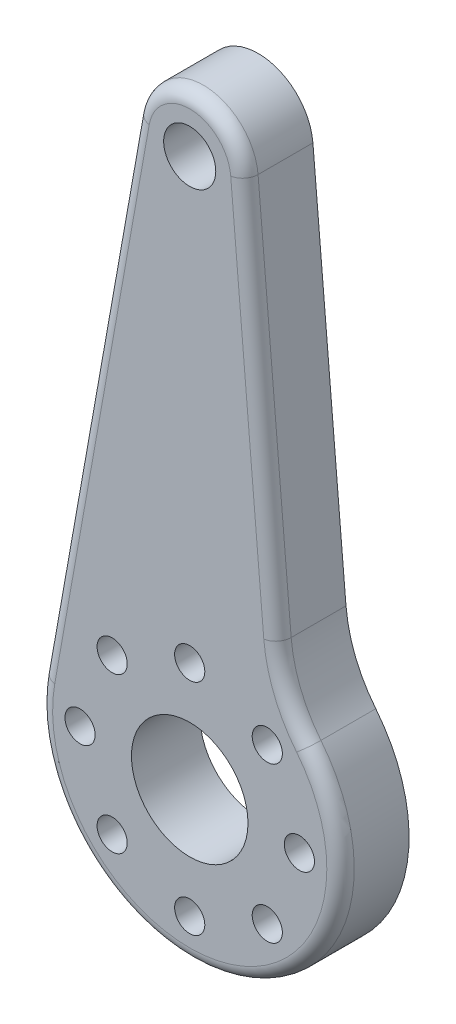
ISO-10303-21;
HEADER;
FILE_DESCRIPTION(('STEP AP214'),'2;1');
FILE_NAME('part.step','',(''),(''),'','','');
FILE_SCHEMA(('AUTOMOTIVE_DESIGN { 1 0 10303 214 1 1 1 1 }'));
ENDSEC;
DATA;
#1=APPLICATION_CONTEXT('core data for automotive mechanical design processes');
#2=APPLICATION_PROTOCOL_DEFINITION('international standard','automotive_design',2000,#1);
#3=PRODUCT_CONTEXT('',#1,'mechanical');
#4=PRODUCT('Part','Part','',(#3));
#5=PRODUCT_RELATED_PRODUCT_CATEGORY('part','',(#4));
#6=PRODUCT_DEFINITION_FORMATION('','',#4);
#7=PRODUCT_DEFINITION_CONTEXT('part definition',#1,'design');
#8=PRODUCT_DEFINITION('design','',#6,#7);
#9=PRODUCT_DEFINITION_SHAPE('','',#8);
#10=(LENGTH_UNIT() NAMED_UNIT(*) SI_UNIT(.MILLI.,.METRE.));
#11=(NAMED_UNIT(*) PLANE_ANGLE_UNIT() SI_UNIT($,.RADIAN.));
#12=(NAMED_UNIT(*) SI_UNIT($,.STERADIAN.) SOLID_ANGLE_UNIT());
#13=UNCERTAINTY_MEASURE_WITH_UNIT(LENGTH_MEASURE(1.E-05),#10,'distance_accuracy_value','');
#14=(GEOMETRIC_REPRESENTATION_CONTEXT(3) GLOBAL_UNCERTAINTY_ASSIGNED_CONTEXT((#13)) GLOBAL_UNIT_ASSIGNED_CONTEXT((#10,
#11,#12)) REPRESENTATION_CONTEXT('',''));
#15=CARTESIAN_POINT('',(0.,0.,0.));
#16=DIRECTION('',(0.,0.,1.));
#17=DIRECTION('',(1.,0.,0.));
#18=AXIS2_PLACEMENT_3D('',#15,#16,#17);
#19=CARTESIAN_POINT('',(-6.98836404370238,-20.3489036018759,5.));
#20=DIRECTION('',(0.,0.,-1.));
#21=DIRECTION('',(-1.,0.,0.));
#22=AXIS2_PLACEMENT_3D('',#19,#20,#21);
#23=CYLINDRICAL_SURFACE('',#22,1.1);
#24=CARTESIAN_POINT('',(-6.98836404370238,-20.3489036018759,5.));
#25=DIRECTION('',(0.,0.,1.));
#26=DIRECTION('',(1.,0.,0.));
#27=AXIS2_PLACEMENT_3D('',#24,#25,#26);
#28=CIRCLE('',#27,1.1);
#29=CARTESIAN_POINT('',(-5.88836404370238,-20.3489036018759,5.));
#30=VERTEX_POINT('',#29);
#31=EDGE_CURVE('E321',#30,#30,#28,.T.);
#32=ORIENTED_EDGE('',*,*,#31,.T.);
#33=EDGE_LOOP('',(#32));
#34=FACE_BOUND('',#33,.T.);
#35=CARTESIAN_POINT('',(-6.98836404370238,-20.3489036018759,2.25));
#36=DIRECTION('',(0.,0.,-1.));
#37=DIRECTION('',(-1.,0.,0.));
#38=AXIS2_PLACEMENT_3D('',#35,#36,#37);
#39=CIRCLE('',#38,1.1);
#40=CARTESIAN_POINT('',(-8.08836404370238,-20.3489036018759,2.25));
#41=VERTEX_POINT('',#40);
#42=EDGE_CURVE('E162',#41,#41,#39,.T.);
#43=ORIENTED_EDGE('',*,*,#42,.T.);
#44=EDGE_LOOP('',(#43));
#45=FACE_BOUND('',#44,.T.);
#46=ADVANCED_FACE('F36',(#34,#45),#23,.F.);
#47=CARTESIAN_POINT('',(-9.33150979421,-26.0057578513683,5.));
#48=DIRECTION('',(0.,0.,-1.));
#49=DIRECTION('',(-1.,0.,0.));
#50=AXIS2_PLACEMENT_3D('',#47,#48,#49);
#51=CYLINDRICAL_SURFACE('',#50,1.1);
#52=CARTESIAN_POINT('',(-9.33150979421,-26.0057578513683,5.));
#53=DIRECTION('',(0.,0.,1.));
#54=DIRECTION('',(1.,0.,0.));
#55=AXIS2_PLACEMENT_3D('',#52,#53,#54);
#56=CIRCLE('',#55,1.1);
#57=CARTESIAN_POINT('',(-8.23150979421,-26.0057578513683,5.));
#58=VERTEX_POINT('',#57);
#59=EDGE_CURVE('E318',#58,#58,#56,.T.);
#60=ORIENTED_EDGE('',*,*,#59,.T.);
#61=EDGE_LOOP('',(#60));
#62=FACE_BOUND('',#61,.T.);
#63=CARTESIAN_POINT('',(-9.33150979421,-26.0057578513683,2.25));
#64=DIRECTION('',(0.,0.,-1.));
#65=DIRECTION('',(-1.,0.,0.));
#66=AXIS2_PLACEMENT_3D('',#63,#64,#65);
#67=CIRCLE('',#66,1.1);
#68=CARTESIAN_POINT('',(-10.43150979421,-26.0057578513683,2.25));
#69=VERTEX_POINT('',#68);
#70=EDGE_CURVE('E159',#69,#69,#67,.T.);
#71=ORIENTED_EDGE('',*,*,#70,.T.);
#72=EDGE_LOOP('',(#71));
#73=FACE_BOUND('',#72,.T.);
#74=ADVANCED_FACE('F237',(#62,#73),#51,.F.);
#75=CARTESIAN_POINT('',(-14.9883640437024,-28.3489036018759,5.));
#76=DIRECTION('',(0.,0.,-1.));
#77=DIRECTION('',(-1.,0.,0.));
#78=AXIS2_PLACEMENT_3D('',#75,#76,#77);
#79=CYLINDRICAL_SURFACE('',#78,1.1);
#80=CARTESIAN_POINT('',(-14.9883640437024,-28.3489036018759,5.));
#81=DIRECTION('',(0.,0.,1.));
#82=DIRECTION('',(1.,0.,0.));
#83=AXIS2_PLACEMENT_3D('',#80,#81,#82);
#84=CIRCLE('',#83,1.1);
#85=CARTESIAN_POINT('',(-13.8883640437024,-28.3489036018759,5.));
#86=VERTEX_POINT('',#85);
#87=EDGE_CURVE('E315',#86,#86,#84,.T.);
#88=ORIENTED_EDGE('',*,*,#87,.T.);
#89=EDGE_LOOP('',(#88));
#90=FACE_BOUND('',#89,.T.);
#91=CARTESIAN_POINT('',(-14.9883640437024,-28.3489036018759,2.25));
#92=DIRECTION('',(0.,0.,-1.));
#93=DIRECTION('',(-1.,0.,0.));
#94=AXIS2_PLACEMENT_3D('',#91,#92,#93);
#95=CIRCLE('',#94,1.1);
#96=CARTESIAN_POINT('',(-16.0883640437024,-28.3489036018759,2.25));
#97=VERTEX_POINT('',#96);
#98=EDGE_CURVE('E156',#97,#97,#95,.T.);
#99=ORIENTED_EDGE('',*,*,#98,.T.);
#100=EDGE_LOOP('',(#99));
#101=FACE_BOUND('',#100,.T.);
#102=ADVANCED_FACE('F243',(#90,#101),#79,.F.);
#103=CARTESIAN_POINT('',(-20.6452182931948,-26.0057578513683,5.));
#104=DIRECTION('',(0.,0.,-1.));
#105=DIRECTION('',(-1.,0.,0.));
#106=AXIS2_PLACEMENT_3D('',#103,#104,#105);
#107=CYLINDRICAL_SURFACE('',#106,1.1);
#108=CARTESIAN_POINT('',(-20.6452182931948,-26.0057578513683,5.));
#109=DIRECTION('',(0.,0.,1.));
#110=DIRECTION('',(1.,0.,0.));
#111=AXIS2_PLACEMENT_3D('',#108,#109,#110);
#112=CIRCLE('',#111,1.1);
#113=CARTESIAN_POINT('',(-19.5452182931948,-26.0057578513683,5.));
#114=VERTEX_POINT('',#113);
#115=EDGE_CURVE('E312',#114,#114,#112,.T.);
#116=ORIENTED_EDGE('',*,*,#115,.T.);
#117=EDGE_LOOP('',(#116));
#118=FACE_BOUND('',#117,.T.);
#119=CARTESIAN_POINT('',(-20.6452182931948,-26.0057578513683,2.25));
#120=DIRECTION('',(0.,0.,-1.));
#121=DIRECTION('',(-1.,0.,0.));
#122=AXIS2_PLACEMENT_3D('',#119,#120,#121);
#123=CIRCLE('',#122,1.1);
#124=CARTESIAN_POINT('',(-21.7452182931948,-26.0057578513683,2.25));
#125=VERTEX_POINT('',#124);
#126=EDGE_CURVE('E153',#125,#125,#123,.T.);
#127=ORIENTED_EDGE('',*,*,#126,.T.);
#128=EDGE_LOOP('',(#127));
#129=FACE_BOUND('',#128,.T.);
#130=ADVANCED_FACE('F409',(#118,#129),#107,.F.);
#131=CARTESIAN_POINT('',(-22.9883640437024,-20.3489036018759,5.));
#132=DIRECTION('',(0.,0.,-1.));
#133=DIRECTION('',(-1.,0.,0.));
#134=AXIS2_PLACEMENT_3D('',#131,#132,#133);
#135=CYLINDRICAL_SURFACE('',#134,1.1);
#136=CARTESIAN_POINT('',(-22.9883640437024,-20.3489036018759,5.));
#137=DIRECTION('',(0.,0.,1.));
#138=DIRECTION('',(1.,0.,0.));
#139=AXIS2_PLACEMENT_3D('',#136,#137,#138);
#140=CIRCLE('',#139,1.1);
#141=CARTESIAN_POINT('',(-21.8883640437024,-20.3489036018759,5.));
#142=VERTEX_POINT('',#141);
#143=EDGE_CURVE('E309',#142,#142,#140,.T.);
#144=ORIENTED_EDGE('',*,*,#143,.T.);
#145=EDGE_LOOP('',(#144));
#146=FACE_BOUND('',#145,.T.);
#147=CARTESIAN_POINT('',(-22.9883640437024,-20.3489036018759,2.25));
#148=DIRECTION('',(0.,0.,-1.));
#149=DIRECTION('',(-1.,0.,0.));
#150=AXIS2_PLACEMENT_3D('',#147,#148,#149);
#151=CIRCLE('',#150,1.1);
#152=CARTESIAN_POINT('',(-24.0883640437024,-20.3489036018759,2.25));
#153=VERTEX_POINT('',#152);
#154=EDGE_CURVE('E150',#153,#153,#151,.T.);
#155=ORIENTED_EDGE('',*,*,#154,.T.);
#156=EDGE_LOOP('',(#155));
#157=FACE_BOUND('',#156,.T.);
#158=ADVANCED_FACE('F405',(#146,#157),#135,.F.);
#159=CARTESIAN_POINT('',(-20.6452182931948,-14.6920493523836,5.));
#160=DIRECTION('',(0.,0.,-1.));
#161=DIRECTION('',(-1.,0.,0.));
#162=AXIS2_PLACEMENT_3D('',#159,#160,#161);
#163=CYLINDRICAL_SURFACE('',#162,1.1);
#164=CARTESIAN_POINT('',(-20.6452182931948,-14.6920493523836,5.));
#165=DIRECTION('',(0.,0.,1.));
#166=DIRECTION('',(1.,0.,0.));
#167=AXIS2_PLACEMENT_3D('',#164,#165,#166);
#168=CIRCLE('',#167,1.1);
#169=CARTESIAN_POINT('',(-19.5452182931948,-14.6920493523836,5.));
#170=VERTEX_POINT('',#169);
#171=EDGE_CURVE('E306',#170,#170,#168,.T.);
#172=ORIENTED_EDGE('',*,*,#171,.T.);
#173=EDGE_LOOP('',(#172));
#174=FACE_BOUND('',#173,.T.);
#175=CARTESIAN_POINT('',(-20.6452182931948,-14.6920493523836,2.25));
#176=DIRECTION('',(0.,0.,-1.));
#177=DIRECTION('',(-1.,0.,0.));
#178=AXIS2_PLACEMENT_3D('',#175,#176,#177);
#179=CIRCLE('',#178,1.1);
#180=CARTESIAN_POINT('',(-21.7452182931948,-14.6920493523836,2.25));
#181=VERTEX_POINT('',#180);
#182=EDGE_CURVE('E147',#181,#181,#179,.T.);
#183=ORIENTED_EDGE('',*,*,#182,.T.);
#184=EDGE_LOOP('',(#183));
#185=FACE_BOUND('',#184,.T.);
#186=ADVANCED_FACE('F401',(#174,#185),#163,.F.);
#187=CARTESIAN_POINT('',(-14.9883640437024,-12.3489036018759,5.));
#188=DIRECTION('',(0.,0.,-1.));
#189=DIRECTION('',(-1.,0.,0.));
#190=AXIS2_PLACEMENT_3D('',#187,#188,#189);
#191=CYLINDRICAL_SURFACE('',#190,1.1);
#192=CARTESIAN_POINT('',(-14.9883640437024,-12.3489036018759,5.));
#193=DIRECTION('',(0.,0.,1.));
#194=DIRECTION('',(1.,0.,0.));
#195=AXIS2_PLACEMENT_3D('',#192,#193,#194);
#196=CIRCLE('',#195,1.1);
#197=CARTESIAN_POINT('',(-13.8883640437024,-12.3489036018759,5.));
#198=VERTEX_POINT('',#197);
#199=EDGE_CURVE('E303',#198,#198,#196,.T.);
#200=ORIENTED_EDGE('',*,*,#199,.T.);
#201=EDGE_LOOP('',(#200));
#202=FACE_BOUND('',#201,.T.);
#203=CARTESIAN_POINT('',(-14.9883640437024,-12.3489036018759,2.25));
#204=DIRECTION('',(0.,0.,-1.));
#205=DIRECTION('',(-1.,0.,0.));
#206=AXIS2_PLACEMENT_3D('',#203,#204,#205);
#207=CIRCLE('',#206,1.1);
#208=CARTESIAN_POINT('',(-16.0883640437024,-12.3489036018759,2.25));
#209=VERTEX_POINT('',#208);
#210=EDGE_CURVE('E143',#209,#209,#207,.T.);
#211=ORIENTED_EDGE('',*,*,#210,.T.);
#212=EDGE_LOOP('',(#211));
#213=FACE_BOUND('',#212,.T.);
#214=ADVANCED_FACE('F347',(#202,#213),#191,.F.);
#215=CARTESIAN_POINT('',(-9.33150979421,-14.6920493523836,5.));
#216=DIRECTION('',(0.,0.,-1.));
#217=DIRECTION('',(-1.,0.,0.));
#218=AXIS2_PLACEMENT_3D('',#215,#216,#217);
#219=CYLINDRICAL_SURFACE('',#218,1.1);
#220=CARTESIAN_POINT('',(-9.33150979421,-14.6920493523836,5.));
#221=DIRECTION('',(0.,0.,1.));
#222=DIRECTION('',(1.,0.,0.));
#223=AXIS2_PLACEMENT_3D('',#220,#221,#222);
#224=CIRCLE('',#223,1.1);
#225=CARTESIAN_POINT('',(-8.23150979421,-14.6920493523836,5.));
#226=VERTEX_POINT('',#225);
#227=EDGE_CURVE('E165',#226,#226,#224,.T.);
#228=ORIENTED_EDGE('',*,*,#227,.T.);
#229=EDGE_LOOP('',(#228));
#230=FACE_BOUND('',#229,.T.);
#231=CARTESIAN_POINT('',(-9.33150979421,-14.6920493523836,2.25));
#232=DIRECTION('',(0.,0.,-1.));
#233=DIRECTION('',(-1.,0.,0.));
#234=AXIS2_PLACEMENT_3D('',#231,#232,#233);
#235=CIRCLE('',#234,1.1);
#236=CARTESIAN_POINT('',(-10.43150979421,-14.6920493523836,2.25));
#237=VERTEX_POINT('',#236);
#238=EDGE_CURVE('E140',#237,#237,#235,.T.);
#239=ORIENTED_EDGE('',*,*,#238,.T.);
#240=EDGE_LOOP('',(#239));
#241=FACE_BOUND('',#240,.T.);
#242=ADVANCED_FACE('F255',(#230,#241),#219,.F.);
#243=CARTESIAN_POINT('',(-14.9883640437024,19.6510963981241,5.));
#244=DIRECTION('',(0.,0.,1.));
#245=DIRECTION('',(1.,0.,0.));
#246=AXIS2_PLACEMENT_3D('',#243,#244,#245);
#247=PLANE('',#246);
#248=DIRECTION('',(0.0857880421638127,-0.996313410439557,0.));
#249=VECTOR('',#248,1.);
#250=CARTESIAN_POINT('',(-11.9994238123837,19.9084605246155,5.));
#251=LINE('',#250,#249);
#252=CARTESIAN_POINT('',(-9.58519646693478,-8.12956225165529,5.));
#253=VERTEX_POINT('',#252);
#254=CARTESIAN_POINT('',(-11.9994238123837,19.9084605246155,5.));
#255=VERTEX_POINT('',#254);
#256=EDGE_CURVE('E177',#253,#255,#251,.F.);
#257=ORIENTED_EDGE('',*,*,#256,.T.);
#258=CARTESIAN_POINT('',(-14.9883640437024,19.6510963981241,5.));
#259=DIRECTION('',(0.,0.,1.));
#260=DIRECTION('',(1.,0.,0.));
#261=AXIS2_PLACEMENT_3D('',#258,#259,#260);
#262=CIRCLE('',#261,3.);
#263=CARTESIAN_POINT('',(-17.9420693438297,20.1760963981241,5.));
#264=VERTEX_POINT('',#263);
#265=EDGE_CURVE('E179',#255,#264,#262,.T.);
#266=ORIENTED_EDGE('',*,*,#265,.T.);
#267=DIRECTION('',(-0.175,-0.984568433375761,0.));
#268=VECTOR('',#267,1.);
#269=CARTESIAN_POINT('',(-24.83404837746,-18.5989036018759,5.));
#270=LINE('',#269,#268);
#271=CARTESIAN_POINT('',(-24.83404837746,-18.5989036018759,5.));
#272=VERTEX_POINT('',#271);
#273=EDGE_CURVE('E171',#264,#272,#270,.T.);
#274=ORIENTED_EDGE('',*,*,#273,.T.);
#275=CARTESIAN_POINT('',(-14.9883640437024,-20.3489036018759,5.));
#276=DIRECTION('',(0.,0.,1.));
#277=DIRECTION('',(1.,0.,0.));
#278=AXIS2_PLACEMENT_3D('',#275,#276,#277);
#279=CIRCLE('',#278,10.);
#280=CARTESIAN_POINT('',(-7.19664257151061,-14.0808036904366,5.));
#281=VERTEX_POINT('',#280);
#282=EDGE_CURVE('E173',#272,#281,#279,.T.);
#283=ORIENTED_EDGE('',*,*,#282,.T.);
#284=CARTESIAN_POINT('',(1.37425104790034,-7.18589378785335,5.));
#285=DIRECTION('',(0.,0.,1.));
#286=DIRECTION('',(1.,0.,0.));
#287=AXIS2_PLACEMENT_3D('',#284,#285,#286);
#288=CIRCLE('',#287,11.);
#289=EDGE_CURVE('E175',#281,#253,#288,.F.);
#290=ORIENTED_EDGE('',*,*,#289,.T.);
#291=EDGE_LOOP('',(#257,#266,#274,#283,#290));
#292=FACE_BOUND('',#291,.T.);
#293=ORIENTED_EDGE('',*,*,#199,.F.);
#294=EDGE_LOOP('',(#293));
#295=FACE_BOUND('',#294,.T.);
#296=ORIENTED_EDGE('',*,*,#143,.F.);
#297=EDGE_LOOP('',(#296));
#298=FACE_BOUND('',#297,.T.);
#299=ORIENTED_EDGE('',*,*,#87,.F.);
#300=EDGE_LOOP('',(#299));
#301=FACE_BOUND('',#300,.T.);
#302=ORIENTED_EDGE('',*,*,#31,.F.);
#303=EDGE_LOOP('',(#302));
#304=FACE_BOUND('',#303,.T.);
#305=CARTESIAN_POINT('',(-14.9883640437024,19.6510963981241,5.));
#306=DIRECTION('',(0.,0.,1.));
#307=DIRECTION('',(1.,0.,0.));
#308=AXIS2_PLACEMENT_3D('',#305,#306,#307);
#309=CIRCLE('',#308,1.9);
#310=CARTESIAN_POINT('',(-13.0883640437024,19.6510963981241,5.));
#311=VERTEX_POINT('',#310);
#312=EDGE_CURVE('E125',#311,#311,#309,.T.);
#313=ORIENTED_EDGE('',*,*,#312,.F.);
#314=EDGE_LOOP('',(#313));
#315=FACE_BOUND('',#314,.T.);
#316=CARTESIAN_POINT('',(-14.9883640437024,-20.3489036018759,5.));
#317=DIRECTION('',(0.,0.,1.));
#318=DIRECTION('',(1.,0.,0.));
#319=AXIS2_PLACEMENT_3D('',#316,#317,#318);
#320=CIRCLE('',#319,4.25);
#321=CARTESIAN_POINT('',(-10.7383640437024,-20.3489036018759,5.));
#322=VERTEX_POINT('',#321);
#323=EDGE_CURVE('E324',#322,#322,#320,.T.);
#324=ORIENTED_EDGE('',*,*,#323,.F.);
#325=EDGE_LOOP('',(#324));
#326=FACE_BOUND('',#325,.T.);
#327=ORIENTED_EDGE('',*,*,#59,.F.);
#328=EDGE_LOOP('',(#327));
#329=FACE_BOUND('',#328,.T.);
#330=ORIENTED_EDGE('',*,*,#115,.F.);
#331=EDGE_LOOP('',(#330));
#332=FACE_BOUND('',#331,.T.);
#333=ORIENTED_EDGE('',*,*,#171,.F.);
#334=EDGE_LOOP('',(#333));
#335=FACE_BOUND('',#334,.T.);
#336=ORIENTED_EDGE('',*,*,#227,.F.);
#337=EDGE_LOOP('',(#336));
#338=FACE_BOUND('',#337,.T.);
#339=ADVANCED_FACE('F208',(#292,#295,#298,#301,#304,#315,#326,#329,#332,#335,#338),#247,.T.);
#340=CARTESIAN_POINT('',(-14.9883640437024,19.6510963981241,0.));
#341=DIRECTION('',(0.,0.,1.));
#342=DIRECTION('',(1.,0.,0.));
#343=AXIS2_PLACEMENT_3D('',#340,#341,#342);
#344=PLANE('',#343);
#345=CARTESIAN_POINT('',(-20.6452182931948,-14.6920493523836,0.));
#346=DIRECTION('',(0.,0.,-1.));
#347=DIRECTION('',(-1.,0.,0.));
#348=AXIS2_PLACEMENT_3D('',#345,#346,#347);
#349=CIRCLE('',#348,1.75);
#350=CARTESIAN_POINT('',(-22.3952182931948,-14.6920493523836,0.));
#351=VERTEX_POINT('',#350);
#352=EDGE_CURVE('E110',#351,#351,#349,.T.);
#353=ORIENTED_EDGE('',*,*,#352,.F.);
#354=EDGE_LOOP('',(#353));
#355=FACE_BOUND('',#354,.T.);
#356=CARTESIAN_POINT('',(-14.9883640437024,-12.3489036018759,0.));
#357=DIRECTION('',(0.,0.,-1.));
#358=DIRECTION('',(-1.,0.,0.));
#359=AXIS2_PLACEMENT_3D('',#356,#357,#358);
#360=CIRCLE('',#359,1.75);
#361=CARTESIAN_POINT('',(-16.7383640437024,-12.3489036018759,0.));
#362=VERTEX_POINT('',#361);
#363=EDGE_CURVE('E268',#362,#362,#360,.T.);
#364=ORIENTED_EDGE('',*,*,#363,.F.);
#365=EDGE_LOOP('',(#364));
#366=FACE_BOUND('',#365,.T.);
#367=CARTESIAN_POINT('',(-9.33150979421,-14.6920493523836,0.));
#368=DIRECTION('',(0.,0.,-1.));
#369=DIRECTION('',(-1.,0.,0.));
#370=AXIS2_PLACEMENT_3D('',#367,#368,#369);
#371=CIRCLE('',#370,1.75);
#372=CARTESIAN_POINT('',(-11.08150979421,-14.6920493523836,0.));
#373=VERTEX_POINT('',#372);
#374=EDGE_CURVE('E272',#373,#373,#371,.T.);
#375=ORIENTED_EDGE('',*,*,#374,.F.);
#376=EDGE_LOOP('',(#375));
#377=FACE_BOUND('',#376,.T.);
#378=CARTESIAN_POINT('',(-6.98836404370238,-20.3489036018759,0.));
#379=DIRECTION('',(0.,0.,-1.));
#380=DIRECTION('',(-1.,0.,0.));
#381=AXIS2_PLACEMENT_3D('',#378,#379,#380);
#382=CIRCLE('',#381,1.75);
#383=CARTESIAN_POINT('',(-8.73836404370238,-20.3489036018759,0.));
#384=VERTEX_POINT('',#383);
#385=EDGE_CURVE('E276',#384,#384,#382,.T.);
#386=ORIENTED_EDGE('',*,*,#385,.F.);
#387=EDGE_LOOP('',(#386));
#388=FACE_BOUND('',#387,.T.);
#389=CARTESIAN_POINT('',(-9.33150979421,-26.0057578513683,0.));
#390=DIRECTION('',(0.,0.,-1.));
#391=DIRECTION('',(-1.,0.,0.));
#392=AXIS2_PLACEMENT_3D('',#389,#390,#391);
#393=CIRCLE('',#392,1.75);
#394=CARTESIAN_POINT('',(-11.08150979421,-26.0057578513683,0.));
#395=VERTEX_POINT('',#394);
#396=EDGE_CURVE('E280',#395,#395,#393,.T.);
#397=ORIENTED_EDGE('',*,*,#396,.F.);
#398=EDGE_LOOP('',(#397));
#399=FACE_BOUND('',#398,.T.);
#400=CARTESIAN_POINT('',(-14.9883640437024,-28.3489036018759,0.));
#401=DIRECTION('',(0.,0.,-1.));
#402=DIRECTION('',(-1.,0.,0.));
#403=AXIS2_PLACEMENT_3D('',#400,#401,#402);
#404=CIRCLE('',#403,1.75);
#405=CARTESIAN_POINT('',(-16.7383640437024,-28.3489036018759,0.));
#406=VERTEX_POINT('',#405);
#407=EDGE_CURVE('E284',#406,#406,#404,.T.);
#408=ORIENTED_EDGE('',*,*,#407,.F.);
#409=EDGE_LOOP('',(#408));
#410=FACE_BOUND('',#409,.T.);
#411=CARTESIAN_POINT('',(-20.6452182931948,-26.0057578513683,0.));
#412=DIRECTION('',(0.,0.,-1.));
#413=DIRECTION('',(-1.,0.,0.));
#414=AXIS2_PLACEMENT_3D('',#411,#412,#413);
#415=CIRCLE('',#414,1.74999999999999);
#416=CARTESIAN_POINT('',(-22.3952182931948,-26.0057578513683,0.));
#417=VERTEX_POINT('',#416);
#418=EDGE_CURVE('E288',#417,#417,#415,.T.);
#419=ORIENTED_EDGE('',*,*,#418,.F.);
#420=EDGE_LOOP('',(#419));
#421=FACE_BOUND('',#420,.T.);
#422=CARTESIAN_POINT('',(-22.9883640437024,-20.3489036018759,0.));
#423=DIRECTION('',(0.,0.,-1.));
#424=DIRECTION('',(-1.,0.,0.));
#425=AXIS2_PLACEMENT_3D('',#422,#423,#424);
#426=CIRCLE('',#425,1.75);
#427=CARTESIAN_POINT('',(-24.7383640437024,-20.3489036018759,0.));
#428=VERTEX_POINT('',#427);
#429=EDGE_CURVE('E291',#428,#428,#426,.T.);
#430=ORIENTED_EDGE('',*,*,#429,.F.);
#431=EDGE_LOOP('',(#430));
#432=FACE_BOUND('',#431,.T.);
#433=CARTESIAN_POINT('',(-14.9883640437024,19.6510963981241,0.));
#434=DIRECTION('',(0.,0.,1.));
#435=DIRECTION('',(1.,0.,0.));
#436=AXIS2_PLACEMENT_3D('',#433,#434,#435);
#437=CIRCLE('',#436,4.);
#438=CARTESIAN_POINT('',(-11.0031104019442,19.9942485667793,0.));
#439=VERTEX_POINT('',#438);
#440=CARTESIAN_POINT('',(-18.9266377772054,20.3510963981241,0.));
#441=VERTEX_POINT('',#440);
#442=EDGE_CURVE('E106',#439,#441,#437,.T.);
#443=ORIENTED_EDGE('',*,*,#442,.F.);
#444=DIRECTION('',(-0.0857880421638127,0.996313410439556,0.));
#445=VECTOR('',#444,1.);
#446=CARTESIAN_POINT('',(-11.0031104019442,19.9942485667793,0.));
#447=LINE('',#446,#445);
#448=CARTESIAN_POINT('',(-8.58888305649522,-8.04377420949147,0.));
#449=VERTEX_POINT('',#448);
#450=EDGE_CURVE('E111',#449,#439,#447,.T.);
#451=ORIENTED_EDGE('',*,*,#450,.F.);
#452=CARTESIAN_POINT('',(1.37425104790034,-7.18589378785335,0.));
#453=DIRECTION('',(0.,0.,1.));
#454=DIRECTION('',(1.,0.,0.));
#455=AXIS2_PLACEMENT_3D('',#452,#453,#454);
#456=CIRCLE('',#455,10.);
#457=CARTESIAN_POINT('',(-6.41747042429143,-13.4539936992927,0.));
#458=VERTEX_POINT('',#457);
#459=EDGE_CURVE('E169',#449,#458,#456,.T.);
#460=ORIENTED_EDGE('',*,*,#459,.T.);
#461=CARTESIAN_POINT('',(-14.9883640437024,-20.3489036018759,0.));
#462=DIRECTION('',(0.,0.,1.));
#463=DIRECTION('',(1.,0.,0.));
#464=AXIS2_PLACEMENT_3D('',#461,#462,#463);
#465=CIRCLE('',#464,11.);
#466=CARTESIAN_POINT('',(-25.8186168108358,-18.4239036018759,0.));
#467=VERTEX_POINT('',#466);
#468=EDGE_CURVE('E127',#467,#458,#465,.T.);
#469=ORIENTED_EDGE('',*,*,#468,.F.);
#470=DIRECTION('',(-0.175,-0.984568433375761,0.));
#471=VECTOR('',#470,1.);
#472=CARTESIAN_POINT('',(-18.9266377772054,20.3510963981241,0.));
#473=LINE('',#472,#471);
#474=EDGE_CURVE('E124',#441,#467,#473,.T.);
#475=ORIENTED_EDGE('',*,*,#474,.F.);
#476=EDGE_LOOP('',(#443,#451,#460,#469,#475));
#477=FACE_BOUND('',#476,.T.);
#478=CARTESIAN_POINT('',(-14.9883640437024,19.6510963981241,0.));
#479=DIRECTION('',(0.,0.,1.));
#480=DIRECTION('',(1.,0.,0.));
#481=AXIS2_PLACEMENT_3D('',#478,#479,#480);
#482=CIRCLE('',#481,1.9);
#483=CARTESIAN_POINT('',(-13.0883640437024,19.6510963981241,0.));
#484=VERTEX_POINT('',#483);
#485=EDGE_CURVE('E130',#484,#484,#482,.T.);
#486=ORIENTED_EDGE('',*,*,#485,.T.);
#487=EDGE_LOOP('',(#486));
#488=FACE_BOUND('',#487,.T.);
#489=CARTESIAN_POINT('',(-14.9883640437024,-20.3489036018759,0.));
#490=DIRECTION('',(0.,0.,1.));
#491=DIRECTION('',(1.,0.,0.));
#492=AXIS2_PLACEMENT_3D('',#489,#490,#491);
#493=CIRCLE('',#492,4.25);
#494=CARTESIAN_POINT('',(-10.7383640437024,-20.3489036018759,0.));
#495=VERTEX_POINT('',#494);
#496=EDGE_CURVE('E323',#495,#495,#493,.T.);
#497=ORIENTED_EDGE('',*,*,#496,.T.);
#498=EDGE_LOOP('',(#497));
#499=FACE_BOUND('',#498,.T.);
#500=ADVANCED_FACE('F120',(#355,#366,#377,#388,#399,#410,#421,#432,#477,#488,#499),#344,.F.);
#501=CARTESIAN_POINT('',(-14.9883640437024,19.6510963981241,5.));
#502=DIRECTION('',(0.,0.,-1.));
#503=DIRECTION('',(-1.,0.,0.));
#504=AXIS2_PLACEMENT_3D('',#501,#502,#503);
#505=CYLINDRICAL_SURFACE('',#504,4.);
#506=DIRECTION('',(0.,0.,-1.));
#507=VECTOR('',#506,1.);
#508=CARTESIAN_POINT('',(-18.9266377772054,20.3510963981241,5.));
#509=LINE('',#508,#507);
#510=CARTESIAN_POINT('',(-18.9266377772054,20.3510963981241,4.));
#511=VERTEX_POINT('',#510);
#512=EDGE_CURVE('E138',#511,#441,#509,.T.);
#513=ORIENTED_EDGE('',*,*,#512,.F.);
#514=CARTESIAN_POINT('',(-14.9883640437024,19.6510963981241,4.));
#515=DIRECTION('',(0.,0.,1.));
#516=DIRECTION('',(1.,0.,0.));
#517=AXIS2_PLACEMENT_3D('',#514,#515,#516);
#518=CIRCLE('',#517,4.);
#519=CARTESIAN_POINT('',(-11.0031104019442,19.9942485667793,4.));
#520=VERTEX_POINT('',#519);
#521=EDGE_CURVE('E108',#511,#520,#518,.F.);
#522=ORIENTED_EDGE('',*,*,#521,.T.);
#523=DIRECTION('',(0.,0.,-1.));
#524=VECTOR('',#523,1.);
#525=CARTESIAN_POINT('',(-11.0031104019442,19.9942485667793,10.));
#526=LINE('',#525,#524);
#527=EDGE_CURVE('E101',#520,#439,#526,.T.);
#528=ORIENTED_EDGE('',*,*,#527,.T.);
#529=ORIENTED_EDGE('',*,*,#442,.T.);
#530=EDGE_LOOP('',(#513,#522,#528,#529));
#531=FACE_BOUND('',#530,.T.);
#532=ADVANCED_FACE('F104',(#531),#505,.T.);
#533=CARTESIAN_POINT('',(-18.9266377772054,20.3510963981241,5.));
#534=DIRECTION('',(0.984568433375761,-0.175,0.));
#535=DIRECTION('',(0.175,0.984568433375761,0.));
#536=AXIS2_PLACEMENT_3D('',#533,#534,#535);
#537=PLANE('',#536);
#538=DIRECTION('',(0.,0.,-1.));
#539=VECTOR('',#538,1.);
#540=CARTESIAN_POINT('',(-25.8186168108358,-18.4239036018759,5.));
#541=LINE('',#540,#539);
#542=CARTESIAN_POINT('',(-25.8186168108358,-18.4239036018759,4.));
#543=VERTEX_POINT('',#542);
#544=EDGE_CURVE('E136',#543,#467,#541,.T.);
#545=ORIENTED_EDGE('',*,*,#544,.F.);
#546=DIRECTION('',(-0.175,-0.984568433375761,0.));
#547=VECTOR('',#546,1.);
#548=CARTESIAN_POINT('',(-18.9266377772054,20.3510963981241,4.));
#549=LINE('',#548,#547);
#550=EDGE_CURVE('E11',#543,#511,#549,.F.);
#551=ORIENTED_EDGE('',*,*,#550,.T.);
#552=ORIENTED_EDGE('',*,*,#512,.T.);
#553=ORIENTED_EDGE('',*,*,#474,.T.);
#554=EDGE_LOOP('',(#545,#551,#552,#553));
#555=FACE_BOUND('',#554,.T.);
#556=ADVANCED_FACE('F218',(#555),#537,.F.);
#557=CARTESIAN_POINT('',(-14.9883640437024,-20.3489036018759,5.));
#558=DIRECTION('',(0.,0.,-1.));
#559=DIRECTION('',(-1.,0.,0.));
#560=AXIS2_PLACEMENT_3D('',#557,#558,#559);
#561=CYLINDRICAL_SURFACE('',#560,11.);
#562=DIRECTION('',(0.,0.,-1.));
#563=VECTOR('',#562,1.);
#564=CARTESIAN_POINT('',(-6.41747042429143,-13.4539936992927,5.));
#565=LINE('',#564,#563);
#566=CARTESIAN_POINT('',(-6.41747042429143,-13.4539936992927,4.));
#567=VERTEX_POINT('',#566);
#568=EDGE_CURVE('E167',#458,#567,#565,.F.);
#569=ORIENTED_EDGE('',*,*,#568,.T.);
#570=CARTESIAN_POINT('',(-14.9883640437024,-20.3489036018759,4.));
#571=DIRECTION('',(0.,0.,1.));
#572=DIRECTION('',(1.,0.,0.));
#573=AXIS2_PLACEMENT_3D('',#570,#571,#572);
#574=CIRCLE('',#573,11.);
#575=EDGE_CURVE('E45',#567,#543,#574,.F.);
#576=ORIENTED_EDGE('',*,*,#575,.T.);
#577=ORIENTED_EDGE('',*,*,#544,.T.);
#578=ORIENTED_EDGE('',*,*,#468,.T.);
#579=EDGE_LOOP('',(#569,#576,#577,#578));
#580=FACE_BOUND('',#579,.T.);
#581=ADVANCED_FACE('F223',(#580),#561,.T.);
#582=CARTESIAN_POINT('',(-14.9883640437024,19.6510963981241,5.));
#583=DIRECTION('',(0.,0.,-1.));
#584=DIRECTION('',(-1.,0.,0.));
#585=AXIS2_PLACEMENT_3D('',#582,#583,#584);
#586=CYLINDRICAL_SURFACE('',#585,1.9);
#587=ORIENTED_EDGE('',*,*,#312,.T.);
#588=EDGE_LOOP('',(#587));
#589=FACE_BOUND('',#588,.T.);
#590=ORIENTED_EDGE('',*,*,#485,.F.);
#591=EDGE_LOOP('',(#590));
#592=FACE_BOUND('',#591,.T.);
#593=ADVANCED_FACE('F225',(#589,#592),#586,.F.);
#594=CARTESIAN_POINT('',(-14.9883640437024,-20.3489036018759,5.));
#595=DIRECTION('',(0.,0.,-1.));
#596=DIRECTION('',(-1.,0.,0.));
#597=AXIS2_PLACEMENT_3D('',#594,#595,#596);
#598=CYLINDRICAL_SURFACE('',#597,4.25);
#599=ORIENTED_EDGE('',*,*,#323,.T.);
#600=EDGE_LOOP('',(#599));
#601=FACE_BOUND('',#600,.T.);
#602=ORIENTED_EDGE('',*,*,#496,.F.);
#603=EDGE_LOOP('',(#602));
#604=FACE_BOUND('',#603,.T.);
#605=ADVANCED_FACE('F231',(#601,#604),#598,.F.);
#606=CARTESIAN_POINT('',(-9.33150979421,-14.6920493523836,2.25));
#607=DIRECTION('',(0.,0.,-1.));
#608=DIRECTION('',(-1.,0.,0.));
#609=AXIS2_PLACEMENT_3D('',#606,#607,#608);
#610=CYLINDRICAL_SURFACE('',#609,1.75);
#611=CARTESIAN_POINT('',(-9.33150979421,-14.6920493523836,2.25));
#612=DIRECTION('',(0.,0.,-1.));
#613=DIRECTION('',(-1.,0.,0.));
#614=AXIS2_PLACEMENT_3D('',#611,#612,#613);
#615=CIRCLE('',#614,1.75);
#616=CARTESIAN_POINT('',(-11.08150979421,-14.6920493523836,2.25));
#617=VERTEX_POINT('',#616);
#618=EDGE_CURVE('E358',#617,#617,#615,.T.);
#619=ORIENTED_EDGE('',*,*,#618,.F.);
#620=EDGE_LOOP('',(#619));
#621=FACE_BOUND('',#620,.T.);
#622=ORIENTED_EDGE('',*,*,#374,.T.);
#623=EDGE_LOOP('',(#622));
#624=FACE_BOUND('',#623,.T.);
#625=ADVANCED_FACE('F251',(#621,#624),#610,.F.);
#626=CARTESIAN_POINT('',(-9.33150979421,-14.6920493523836,2.25));
#627=DIRECTION('',(0.,0.,-1.));
#628=DIRECTION('',(-1.,0.,0.));
#629=AXIS2_PLACEMENT_3D('',#626,#627,#628);
#630=PLANE('',#629);
#631=ORIENTED_EDGE('',*,*,#238,.F.);
#632=EDGE_LOOP('',(#631));
#633=FACE_BOUND('',#632,.T.);
#634=ORIENTED_EDGE('',*,*,#618,.T.);
#635=EDGE_LOOP('',(#634));
#636=FACE_BOUND('',#635,.T.);
#637=ADVANCED_FACE('F351',(#633,#636),#630,.T.);
#638=CARTESIAN_POINT('',(-14.9883640437024,-12.3489036018759,2.25));
#639=DIRECTION('',(0.,0.,-1.));
#640=DIRECTION('',(-1.,0.,0.));
#641=AXIS2_PLACEMENT_3D('',#638,#639,#640);
#642=CYLINDRICAL_SURFACE('',#641,1.75);
#643=CARTESIAN_POINT('',(-14.9883640437024,-12.3489036018759,2.25));
#644=DIRECTION('',(0.,0.,-1.));
#645=DIRECTION('',(-1.,0.,0.));
#646=AXIS2_PLACEMENT_3D('',#643,#644,#645);
#647=CIRCLE('',#646,1.75);
#648=CARTESIAN_POINT('',(-16.7383640437024,-12.3489036018759,2.25));
#649=VERTEX_POINT('',#648);
#650=EDGE_CURVE('E363',#649,#649,#647,.T.);
#651=ORIENTED_EDGE('',*,*,#650,.F.);
#652=EDGE_LOOP('',(#651));
#653=FACE_BOUND('',#652,.T.);
#654=ORIENTED_EDGE('',*,*,#363,.T.);
#655=EDGE_LOOP('',(#654));
#656=FACE_BOUND('',#655,.T.);
#657=ADVANCED_FACE('F354',(#653,#656),#642,.F.);
#658=CARTESIAN_POINT('',(-14.9883640437024,-12.3489036018759,2.25));
#659=DIRECTION('',(0.,0.,-1.));
#660=DIRECTION('',(-1.,0.,0.));
#661=AXIS2_PLACEMENT_3D('',#658,#659,#660);
#662=PLANE('',#661);
#663=ORIENTED_EDGE('',*,*,#210,.F.);
#664=EDGE_LOOP('',(#663));
#665=FACE_BOUND('',#664,.T.);
#666=ORIENTED_EDGE('',*,*,#650,.T.);
#667=EDGE_LOOP('',(#666));
#668=FACE_BOUND('',#667,.T.);
#669=ADVANCED_FACE('F376',(#665,#668),#662,.T.);
#670=CARTESIAN_POINT('',(-20.6452182931948,-14.6920493523836,2.25));
#671=DIRECTION('',(0.,0.,-1.));
#672=DIRECTION('',(-1.,0.,0.));
#673=AXIS2_PLACEMENT_3D('',#670,#671,#672);
#674=CYLINDRICAL_SURFACE('',#673,1.75);
#675=CARTESIAN_POINT('',(-20.6452182931948,-14.6920493523836,2.25));
#676=DIRECTION('',(0.,0.,-1.));
#677=DIRECTION('',(-1.,0.,0.));
#678=AXIS2_PLACEMENT_3D('',#675,#676,#677);
#679=CIRCLE('',#678,1.75);
#680=CARTESIAN_POINT('',(-22.3952182931948,-14.6920493523836,2.25));
#681=VERTEX_POINT('',#680);
#682=EDGE_CURVE('E370',#681,#681,#679,.T.);
#683=ORIENTED_EDGE('',*,*,#682,.F.);
#684=EDGE_LOOP('',(#683));
#685=FACE_BOUND('',#684,.T.);
#686=ORIENTED_EDGE('',*,*,#352,.T.);
#687=EDGE_LOOP('',(#686));
#688=FACE_BOUND('',#687,.T.);
#689=ADVANCED_FACE('F373',(#685,#688),#674,.F.);
#690=CARTESIAN_POINT('',(-20.6452182931948,-14.6920493523836,2.25));
#691=DIRECTION('',(0.,0.,-1.));
#692=DIRECTION('',(-1.,0.,0.));
#693=AXIS2_PLACEMENT_3D('',#690,#691,#692);
#694=PLANE('',#693);
#695=ORIENTED_EDGE('',*,*,#182,.F.);
#696=EDGE_LOOP('',(#695));
#697=FACE_BOUND('',#696,.T.);
#698=ORIENTED_EDGE('',*,*,#682,.T.);
#699=EDGE_LOOP('',(#698));
#700=FACE_BOUND('',#699,.T.);
#701=ADVANCED_FACE('F375',(#697,#700),#694,.T.);
#702=CARTESIAN_POINT('',(-22.9883640437024,-20.3489036018759,2.25));
#703=DIRECTION('',(0.,0.,-1.));
#704=DIRECTION('',(-1.,0.,0.));
#705=AXIS2_PLACEMENT_3D('',#702,#703,#704);
#706=CYLINDRICAL_SURFACE('',#705,1.75);
#707=CARTESIAN_POINT('',(-22.9883640437024,-20.3489036018759,2.25));
#708=DIRECTION('',(0.,0.,-1.));
#709=DIRECTION('',(-1.,0.,0.));
#710=AXIS2_PLACEMENT_3D('',#707,#708,#709);
#711=CIRCLE('',#710,1.75);
#712=CARTESIAN_POINT('',(-24.7383640437024,-20.3489036018759,2.25));
#713=VERTEX_POINT('',#712);
#714=EDGE_CURVE('E144',#713,#713,#711,.T.);
#715=ORIENTED_EDGE('',*,*,#714,.F.);
#716=EDGE_LOOP('',(#715));
#717=FACE_BOUND('',#716,.T.);
#718=ORIENTED_EDGE('',*,*,#429,.T.);
#719=EDGE_LOOP('',(#718));
#720=FACE_BOUND('',#719,.T.);
#721=ADVANCED_FACE('F383',(#717,#720),#706,.F.);
#722=CARTESIAN_POINT('',(-22.9883640437024,-20.3489036018759,2.25));
#723=DIRECTION('',(0.,0.,-1.));
#724=DIRECTION('',(-1.,0.,0.));
#725=AXIS2_PLACEMENT_3D('',#722,#723,#724);
#726=PLANE('',#725);
#727=ORIENTED_EDGE('',*,*,#154,.F.);
#728=EDGE_LOOP('',(#727));
#729=FACE_BOUND('',#728,.T.);
#730=ORIENTED_EDGE('',*,*,#714,.T.);
#731=EDGE_LOOP('',(#730));
#732=FACE_BOUND('',#731,.T.);
#733=ADVANCED_FACE('F391',(#729,#732),#726,.T.);
#734=CARTESIAN_POINT('',(-20.6452182931948,-26.0057578513683,2.25));
#735=DIRECTION('',(0.,0.,-1.));
#736=DIRECTION('',(-1.,0.,0.));
#737=AXIS2_PLACEMENT_3D('',#734,#735,#736);
#738=CYLINDRICAL_SURFACE('',#737,1.74999999999999);
#739=CARTESIAN_POINT('',(-20.6452182931948,-26.0057578513683,2.25));
#740=DIRECTION('',(0.,0.,-1.));
#741=DIRECTION('',(-1.,0.,0.));
#742=AXIS2_PLACEMENT_3D('',#739,#740,#741);
#743=CIRCLE('',#742,1.74999999999999);
#744=CARTESIAN_POINT('',(-22.3952182931948,-26.0057578513683,2.25));
#745=VERTEX_POINT('',#744);
#746=EDGE_CURVE('E293',#745,#745,#743,.T.);
#747=ORIENTED_EDGE('',*,*,#746,.F.);
#748=EDGE_LOOP('',(#747));
#749=FACE_BOUND('',#748,.T.);
#750=ORIENTED_EDGE('',*,*,#418,.T.);
#751=EDGE_LOOP('',(#750));
#752=FACE_BOUND('',#751,.T.);
#753=ADVANCED_FACE('F394',(#749,#752),#738,.F.);
#754=CARTESIAN_POINT('',(-20.6452182931948,-26.0057578513683,2.25));
#755=DIRECTION('',(0.,0.,-1.));
#756=DIRECTION('',(-1.,0.,0.));
#757=AXIS2_PLACEMENT_3D('',#754,#755,#756);
#758=PLANE('',#757);
#759=ORIENTED_EDGE('',*,*,#126,.F.);
#760=EDGE_LOOP('',(#759));
#761=FACE_BOUND('',#760,.T.);
#762=ORIENTED_EDGE('',*,*,#746,.T.);
#763=EDGE_LOOP('',(#762));
#764=FACE_BOUND('',#763,.T.);
#765=ADVANCED_FACE('F503',(#761,#764),#758,.T.);
#766=CARTESIAN_POINT('',(-14.9883640437024,-28.3489036018759,2.25));
#767=DIRECTION('',(0.,0.,-1.));
#768=DIRECTION('',(-1.,0.,0.));
#769=AXIS2_PLACEMENT_3D('',#766,#767,#768);
#770=CYLINDRICAL_SURFACE('',#769,1.75);
#771=CARTESIAN_POINT('',(-14.9883640437024,-28.3489036018759,2.25));
#772=DIRECTION('',(0.,0.,-1.));
#773=DIRECTION('',(-1.,0.,0.));
#774=AXIS2_PLACEMENT_3D('',#771,#772,#773);
#775=CIRCLE('',#774,1.75);
#776=CARTESIAN_POINT('',(-16.7383640437024,-28.3489036018759,2.25));
#777=VERTEX_POINT('',#776);
#778=EDGE_CURVE('E429',#777,#777,#775,.T.);
#779=ORIENTED_EDGE('',*,*,#778,.F.);
#780=EDGE_LOOP('',(#779));
#781=FACE_BOUND('',#780,.T.);
#782=ORIENTED_EDGE('',*,*,#407,.T.);
#783=EDGE_LOOP('',(#782));
#784=FACE_BOUND('',#783,.T.);
#785=ADVANCED_FACE('F425',(#781,#784),#770,.F.);
#786=CARTESIAN_POINT('',(-14.9883640437024,-28.3489036018759,2.25));
#787=DIRECTION('',(0.,0.,-1.));
#788=DIRECTION('',(-1.,0.,0.));
#789=AXIS2_PLACEMENT_3D('',#786,#787,#788);
#790=PLANE('',#789);
#791=ORIENTED_EDGE('',*,*,#98,.F.);
#792=EDGE_LOOP('',(#791));
#793=FACE_BOUND('',#792,.T.);
#794=ORIENTED_EDGE('',*,*,#778,.T.);
#795=EDGE_LOOP('',(#794));
#796=FACE_BOUND('',#795,.T.);
#797=ADVANCED_FACE('F421',(#793,#796),#790,.T.);
#798=CARTESIAN_POINT('',(-9.33150979421,-26.0057578513683,2.25));
#799=DIRECTION('',(0.,0.,-1.));
#800=DIRECTION('',(-1.,0.,0.));
#801=AXIS2_PLACEMENT_3D('',#798,#799,#800);
#802=CYLINDRICAL_SURFACE('',#801,1.75);
#803=CARTESIAN_POINT('',(-9.33150979421,-26.0057578513683,2.25));
#804=DIRECTION('',(0.,0.,-1.));
#805=DIRECTION('',(-1.,0.,0.));
#806=AXIS2_PLACEMENT_3D('',#803,#804,#805);
#807=CIRCLE('',#806,1.75);
#808=CARTESIAN_POINT('',(-11.08150979421,-26.0057578513683,2.25));
#809=VERTEX_POINT('',#808);
#810=EDGE_CURVE('E433',#809,#809,#807,.T.);
#811=ORIENTED_EDGE('',*,*,#810,.F.);
#812=EDGE_LOOP('',(#811));
#813=FACE_BOUND('',#812,.T.);
#814=ORIENTED_EDGE('',*,*,#396,.T.);
#815=EDGE_LOOP('',(#814));
#816=FACE_BOUND('',#815,.T.);
#817=ADVANCED_FACE('F424',(#813,#816),#802,.F.);
#818=CARTESIAN_POINT('',(-9.33150979421,-26.0057578513683,2.25));
#819=DIRECTION('',(0.,0.,-1.));
#820=DIRECTION('',(-1.,0.,0.));
#821=AXIS2_PLACEMENT_3D('',#818,#819,#820);
#822=PLANE('',#821);
#823=ORIENTED_EDGE('',*,*,#70,.F.);
#824=EDGE_LOOP('',(#823));
#825=FACE_BOUND('',#824,.T.);
#826=ORIENTED_EDGE('',*,*,#810,.T.);
#827=EDGE_LOOP('',(#826));
#828=FACE_BOUND('',#827,.T.);
#829=ADVANCED_FACE('F446',(#825,#828),#822,.T.);
#830=CARTESIAN_POINT('',(-6.98836404370238,-20.3489036018759,2.25));
#831=DIRECTION('',(0.,0.,-1.));
#832=DIRECTION('',(-1.,0.,0.));
#833=AXIS2_PLACEMENT_3D('',#830,#831,#832);
#834=CYLINDRICAL_SURFACE('',#833,1.75);
#835=CARTESIAN_POINT('',(-6.98836404370238,-20.3489036018759,2.25));
#836=DIRECTION('',(0.,0.,-1.));
#837=DIRECTION('',(-1.,0.,0.));
#838=AXIS2_PLACEMENT_3D('',#835,#836,#837);
#839=CIRCLE('',#838,1.75);
#840=CARTESIAN_POINT('',(-8.73836404370238,-20.3489036018759,2.25));
#841=VERTEX_POINT('',#840);
#842=EDGE_CURVE('E361',#841,#841,#839,.T.);
#843=ORIENTED_EDGE('',*,*,#842,.F.);
#844=EDGE_LOOP('',(#843));
#845=FACE_BOUND('',#844,.T.);
#846=ORIENTED_EDGE('',*,*,#385,.T.);
#847=EDGE_LOOP('',(#846));
#848=FACE_BOUND('',#847,.T.);
#849=ADVANCED_FACE('F443',(#845,#848),#834,.F.);
#850=CARTESIAN_POINT('',(-6.98836404370238,-20.3489036018759,2.25));
#851=DIRECTION('',(0.,0.,-1.));
#852=DIRECTION('',(-1.,0.,0.));
#853=AXIS2_PLACEMENT_3D('',#850,#851,#852);
#854=PLANE('',#853);
#855=ORIENTED_EDGE('',*,*,#42,.F.);
#856=EDGE_LOOP('',(#855));
#857=FACE_BOUND('',#856,.T.);
#858=ORIENTED_EDGE('',*,*,#842,.T.);
#859=EDGE_LOOP('',(#858));
#860=FACE_BOUND('',#859,.T.);
#861=ADVANCED_FACE('F441',(#857,#860),#854,.T.);
#862=CARTESIAN_POINT('',(-11.0031104019442,19.9942485667793,10.));
#863=DIRECTION('',(-0.996313410439556,-0.0857880421638127,0.));
#864=DIRECTION('',(0.0857880421638127,-0.996313410439557,0.));
#865=AXIS2_PLACEMENT_3D('',#862,#863,#864);
#866=PLANE('',#865);
#867=ORIENTED_EDGE('',*,*,#527,.F.);
#868=DIRECTION('',(0.0857880421638127,-0.996313410439557,0.));
#869=VECTOR('',#868,1.);
#870=CARTESIAN_POINT('',(-8.58888305649522,-8.04377420949151,4.));
#871=LINE('',#870,#869);
#872=CARTESIAN_POINT('',(-8.58888305649522,-8.04377420949148,4.));
#873=VERTEX_POINT('',#872);
#874=EDGE_CURVE('E183',#520,#873,#871,.T.);
#875=ORIENTED_EDGE('',*,*,#874,.T.);
#876=DIRECTION('',(0.,0.,1.));
#877=VECTOR('',#876,1.);
#878=CARTESIAN_POINT('',(-8.58888305649522,-8.04377420949148,0.));
#879=LINE('',#878,#877);
#880=EDGE_CURVE('E115',#873,#449,#879,.F.);
#881=ORIENTED_EDGE('',*,*,#880,.T.);
#882=ORIENTED_EDGE('',*,*,#450,.T.);
#883=EDGE_LOOP('',(#867,#875,#881,#882));
#884=FACE_BOUND('',#883,.T.);
#885=ADVANCED_FACE('F114',(#884),#866,.F.);
#886=CARTESIAN_POINT('',(1.37425104790034,-7.18589378785335,5.));
#887=DIRECTION('',(0.,0.,-1.));
#888=DIRECTION('',(-1.,0.,0.));
#889=AXIS2_PLACEMENT_3D('',#886,#887,#888);
#890=CYLINDRICAL_SURFACE('',#889,10.);
#891=ORIENTED_EDGE('',*,*,#880,.F.);
#892=CARTESIAN_POINT('',(1.37425104790034,-7.18589378785335,4.));
#893=DIRECTION('',(0.,0.,1.));
#894=DIRECTION('',(1.,0.,0.));
#895=AXIS2_PLACEMENT_3D('',#892,#893,#894);
#896=CIRCLE('',#895,10.);
#897=EDGE_CURVE('E60',#873,#567,#896,.T.);
#898=ORIENTED_EDGE('',*,*,#897,.T.);
#899=ORIENTED_EDGE('',*,*,#568,.F.);
#900=ORIENTED_EDGE('',*,*,#459,.F.);
#901=EDGE_LOOP('',(#891,#898,#899,#900));
#902=FACE_BOUND('',#901,.T.);
#903=ADVANCED_FACE('F222',(#902),#890,.F.);
#904=CARTESIAN_POINT('',(1.37425104790034,-7.18589378785335,4.));
#905=DIRECTION('',(0.,0.,1.));
#906=DIRECTION('',(1.,0.,0.));
#907=AXIS2_PLACEMENT_3D('',#904,#905,#906);
#908=TOROIDAL_SURFACE('',#907,11.,1.);
#909=CARTESIAN_POINT('',(-9.58519646693478,-8.12956225165529,4.));
#910=DIRECTION('',(-0.0857880421638123,0.996313410439556,0.));
#911=DIRECTION('',(-0.996313410439557,-0.0857880421638123,0.));
#912=AXIS2_PLACEMENT_3D('',#909,#910,#911);
#913=CIRCLE('',#912,1.);
#914=EDGE_CURVE('E193',#253,#873,#913,.T.);
#915=ORIENTED_EDGE('',*,*,#914,.F.);
#916=ORIENTED_EDGE('',*,*,#289,.F.);
#917=CARTESIAN_POINT('',(-7.19664257151061,-14.0808036904366,4.));
#918=DIRECTION('',(0.626809991143933,-0.779172147219177,0.));
#919=DIRECTION('',(0.779172147219177,0.626809991143933,0.));
#920=AXIS2_PLACEMENT_3D('',#917,#918,#919);
#921=CIRCLE('',#920,1.);
#922=EDGE_CURVE('E40',#567,#281,#921,.T.);
#923=ORIENTED_EDGE('',*,*,#922,.F.);
#924=ORIENTED_EDGE('',*,*,#897,.F.);
#925=EDGE_LOOP('',(#915,#916,#923,#924));
#926=FACE_BOUND('',#925,.T.);
#927=ADVANCED_FACE('F38',(#926),#908,.T.);
#928=CARTESIAN_POINT('',(-14.9883640437024,-20.3489036018759,4.));
#929=DIRECTION('',(0.,0.,1.));
#930=DIRECTION('',(1.,0.,0.));
#931=AXIS2_PLACEMENT_3D('',#928,#929,#930);
#932=TOROIDAL_SURFACE('',#931,10.,1.);
#933=ORIENTED_EDGE('',*,*,#922,.T.);
#934=ORIENTED_EDGE('',*,*,#282,.F.);
#935=CARTESIAN_POINT('',(-24.83404837746,-18.5989036018759,4.));
#936=DIRECTION('',(0.175000000000002,0.984568433375761,0.));
#937=DIRECTION('',(-0.984568433375761,0.175000000000002,0.));
#938=AXIS2_PLACEMENT_3D('',#935,#936,#937);
#939=CIRCLE('',#938,1.);
#940=EDGE_CURVE('E191',#543,#272,#939,.T.);
#941=ORIENTED_EDGE('',*,*,#940,.F.);
#942=ORIENTED_EDGE('',*,*,#575,.F.);
#943=EDGE_LOOP('',(#933,#934,#941,#942));
#944=FACE_BOUND('',#943,.T.);
#945=ADVANCED_FACE('F203',(#944),#932,.T.);
#946=CARTESIAN_POINT('',(-11.9994238123837,19.9084605246155,4.));
#947=DIRECTION('',(-0.0857880421638127,0.996313410439557,0.));
#948=DIRECTION('',(-0.996313410439556,-0.0857880421638127,0.));
#949=AXIS2_PLACEMENT_3D('',#946,#947,#948);
#950=CYLINDRICAL_SURFACE('',#949,1.);
#951=ORIENTED_EDGE('',*,*,#914,.T.);
#952=ORIENTED_EDGE('',*,*,#874,.F.);
#953=CARTESIAN_POINT('',(-11.9994238123837,19.9084605246155,4.));
#954=DIRECTION('',(-0.085788042163814,0.996313410439556,0.));
#955=DIRECTION('',(-0.996313410439556,-0.085788042163814,0.));
#956=AXIS2_PLACEMENT_3D('',#953,#954,#955);
#957=CIRCLE('',#956,1.);
#958=EDGE_CURVE('E189',#255,#520,#957,.T.);
#959=ORIENTED_EDGE('',*,*,#958,.F.);
#960=ORIENTED_EDGE('',*,*,#256,.F.);
#961=EDGE_LOOP('',(#951,#952,#959,#960));
#962=FACE_BOUND('',#961,.T.);
#963=ADVANCED_FACE('F221',(#962),#950,.T.);
#964=CARTESIAN_POINT('',(-17.9420693438297,20.1760963981241,4.));
#965=DIRECTION('',(0.175,0.984568433375761,0.));
#966=DIRECTION('',(-0.984568433375761,0.175,0.));
#967=AXIS2_PLACEMENT_3D('',#964,#965,#966);
#968=CYLINDRICAL_SURFACE('',#967,1.);
#969=ORIENTED_EDGE('',*,*,#940,.T.);
#970=ORIENTED_EDGE('',*,*,#273,.F.);
#971=CARTESIAN_POINT('',(-17.9420693438297,20.1760963981241,4.));
#972=DIRECTION('',(0.175000000000002,0.984568433375761,0.));
#973=DIRECTION('',(-0.984568433375761,0.175000000000002,0.));
#974=AXIS2_PLACEMENT_3D('',#971,#972,#973);
#975=CIRCLE('',#974,1.);
#976=EDGE_CURVE('E187',#511,#264,#975,.T.);
#977=ORIENTED_EDGE('',*,*,#976,.F.);
#978=ORIENTED_EDGE('',*,*,#550,.F.);
#979=EDGE_LOOP('',(#969,#970,#977,#978));
#980=FACE_BOUND('',#979,.T.);
#981=ADVANCED_FACE('F215',(#980),#968,.T.);
#982=CARTESIAN_POINT('',(-14.9883640437024,19.6510963981241,4.));
#983=DIRECTION('',(0.,0.,1.));
#984=DIRECTION('',(1.,0.,0.));
#985=AXIS2_PLACEMENT_3D('',#982,#983,#984);
#986=TOROIDAL_SURFACE('',#985,3.,1.);
#987=ORIENTED_EDGE('',*,*,#958,.T.);
#988=ORIENTED_EDGE('',*,*,#521,.F.);
#989=ORIENTED_EDGE('',*,*,#976,.T.);
#990=ORIENTED_EDGE('',*,*,#265,.F.);
#991=EDGE_LOOP('',(#987,#988,#989,#990));
#992=FACE_BOUND('',#991,.T.);
#993=ADVANCED_FACE('F220',(#992),#986,.T.);
#994=CLOSED_SHELL('',(#46,#74,#102,#130,#158,#186,#214,#242,#339,#500,#532,#556,#581,#593,#605,
#625,#637,#657,#669,#689,#701,#721,#733,#753,#765,#785,#797,#817,#829,#849,#861,#885,#903,#927,
#945,#963,#981,#993));
#995=MANIFOLD_SOLID_BREP('B2',#994);
#996=ADVANCED_BREP_SHAPE_REPRESENTATION('',(#18,#995),#14);
#997=SHAPE_DEFINITION_REPRESENTATION(#9,#996);
ENDSEC;
END-ISO-10303-21;
